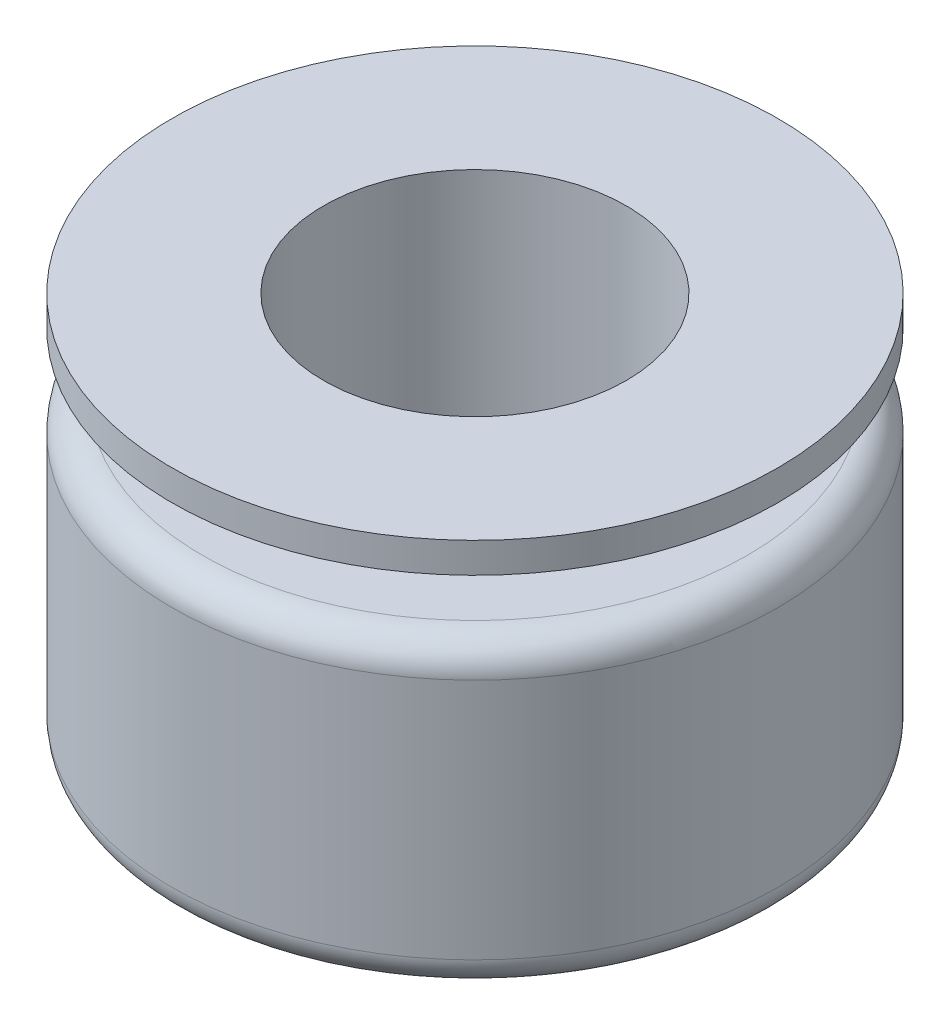
ISO-10303-21;
HEADER;
FILE_DESCRIPTION(('STEP AP214'),'2;1');
FILE_NAME('part.step','',(''),(''),'','','');
FILE_SCHEMA(('AUTOMOTIVE_DESIGN { 1 0 10303 214 1 1 1 1 }'));
ENDSEC;
DATA;
#1=APPLICATION_CONTEXT('core data for automotive mechanical design processes');
#2=APPLICATION_PROTOCOL_DEFINITION('international standard','automotive_design',2000,#1);
#3=PRODUCT_CONTEXT('',#1,'mechanical');
#4=PRODUCT('Part','Part','',(#3));
#5=PRODUCT_RELATED_PRODUCT_CATEGORY('part','',(#4));
#6=PRODUCT_DEFINITION_FORMATION('','',#4);
#7=PRODUCT_DEFINITION_CONTEXT('part definition',#1,'design');
#8=PRODUCT_DEFINITION('design','',#6,#7);
#9=PRODUCT_DEFINITION_SHAPE('','',#8);
#10=(LENGTH_UNIT() NAMED_UNIT(*) SI_UNIT(.MILLI.,.METRE.));
#11=(NAMED_UNIT(*) PLANE_ANGLE_UNIT() SI_UNIT($,.RADIAN.));
#12=(NAMED_UNIT(*) SI_UNIT($,.STERADIAN.) SOLID_ANGLE_UNIT());
#13=UNCERTAINTY_MEASURE_WITH_UNIT(LENGTH_MEASURE(1.E-05),#10,'distance_accuracy_value','');
#14=(GEOMETRIC_REPRESENTATION_CONTEXT(3) GLOBAL_UNCERTAINTY_ASSIGNED_CONTEXT((#13)) GLOBAL_UNIT_ASSIGNED_CONTEXT((#10,
#11,#12)) REPRESENTATION_CONTEXT('',''));
#15=CARTESIAN_POINT('',(0.,0.,0.));
#16=DIRECTION('',(0.,0.,1.));
#17=DIRECTION('',(1.,0.,0.));
#18=AXIS2_PLACEMENT_3D('',#15,#16,#17);
#19=CARTESIAN_POINT('',(15.,29.5,7.));
#20=DIRECTION('',(0.,1.,0.));
#21=DIRECTION('',(1.,0.,0.));
#22=AXIS2_PLACEMENT_3D('',#19,#20,#21);
#23=PLANE('',#22);
#24=CARTESIAN_POINT('',(15.,29.5,7.));
#25=DIRECTION('',(0.,1.,0.));
#26=DIRECTION('',(-1.,0.,0.));
#27=AXIS2_PLACEMENT_3D('',#24,#25,#26);
#28=CIRCLE('',#27,3.);
#29=CARTESIAN_POINT('',(18.,29.5,7.));
#30=VERTEX_POINT('',#29);
#31=EDGE_CURVE('E87',#30,#30,#28,.T.);
#32=ORIENTED_EDGE('',*,*,#31,.T.);
#33=EDGE_LOOP('',(#32));
#34=FACE_BOUND('',#33,.T.);
#35=CARTESIAN_POINT('',(15.,29.5,7.));
#36=DIRECTION('',(0.,1.,0.));
#37=DIRECTION('',(-1.,0.,0.));
#38=AXIS2_PLACEMENT_3D('',#35,#36,#37);
#39=CIRCLE('',#38,5.);
#40=CARTESIAN_POINT('',(20.,29.5,7.));
#41=VERTEX_POINT('',#40);
#42=EDGE_CURVE('E11',#41,#41,#39,.T.);
#43=ORIENTED_EDGE('',*,*,#42,.F.);
#44=EDGE_LOOP('',(#43));
#45=FACE_BOUND('',#44,.T.);
#46=ADVANCED_FACE('F17',(#34,#45),#23,.F.);
#47=CARTESIAN_POINT('',(15.,30.,7.));
#48=DIRECTION('',(0.,1.,0.));
#49=DIRECTION('',(1.,0.,0.));
#50=AXIS2_PLACEMENT_3D('',#47,#48,#49);
#51=PLANE('',#50);
#52=CARTESIAN_POINT('',(15.,30.,7.));
#53=DIRECTION('',(0.,-1.,0.));
#54=DIRECTION('',(-1.,0.,0.));
#55=AXIS2_PLACEMENT_3D('',#52,#53,#54);
#56=CIRCLE('',#55,2.5);
#57=CARTESIAN_POINT('',(17.5,30.,7.));
#58=VERTEX_POINT('',#57);
#59=EDGE_CURVE('E94',#58,#58,#56,.T.);
#60=ORIENTED_EDGE('',*,*,#59,.T.);
#61=EDGE_LOOP('',(#60));
#62=FACE_BOUND('',#61,.T.);
#63=CARTESIAN_POINT('',(15.,30.,7.));
#64=DIRECTION('',(0.,1.,0.));
#65=DIRECTION('',(-1.,0.,0.));
#66=AXIS2_PLACEMENT_3D('',#63,#64,#65);
#67=CIRCLE('',#66,5.);
#68=CARTESIAN_POINT('',(20.,30.,7.));
#69=VERTEX_POINT('',#68);
#70=EDGE_CURVE('E27',#69,#69,#67,.T.);
#71=ORIENTED_EDGE('',*,*,#70,.T.);
#72=EDGE_LOOP('',(#71));
#73=FACE_BOUND('',#72,.T.);
#74=ADVANCED_FACE('F112',(#62,#73),#51,.T.);
#75=CARTESIAN_POINT('',(15.,29.5,7.));
#76=DIRECTION('',(0.,1.,0.));
#77=DIRECTION('',(-1.,0.,0.));
#78=AXIS2_PLACEMENT_3D('',#75,#76,#77);
#79=CYLINDRICAL_SURFACE('',#78,5.);
#80=ORIENTED_EDGE('',*,*,#42,.T.);
#81=EDGE_LOOP('',(#80));
#82=FACE_BOUND('',#81,.T.);
#83=ORIENTED_EDGE('',*,*,#70,.F.);
#84=EDGE_LOOP('',(#83));
#85=FACE_BOUND('',#84,.T.);
#86=ADVANCED_FACE('F114',(#82,#85),#79,.T.);
#87=CARTESIAN_POINT('',(15.,29.5,7.));
#88=DIRECTION('',(0.,1.,0.));
#89=DIRECTION('',(-1.,0.,0.));
#90=AXIS2_PLACEMENT_3D('',#87,#88,#89);
#91=CYLINDRICAL_SURFACE('',#90,2.5);
#92=ORIENTED_EDGE('',*,*,#59,.F.);
#93=EDGE_LOOP('',(#92));
#94=FACE_BOUND('',#93,.T.);
#95=CARTESIAN_POINT('',(15.,23.5,7.));
#96=DIRECTION('',(0.,1.,0.));
#97=DIRECTION('',(-1.,0.,0.));
#98=AXIS2_PLACEMENT_3D('',#95,#96,#97);
#99=CIRCLE('',#98,2.5);
#100=CARTESIAN_POINT('',(17.5,23.5,7.));
#101=VERTEX_POINT('',#100);
#102=EDGE_CURVE('E20',#101,#101,#99,.T.);
#103=ORIENTED_EDGE('',*,*,#102,.F.);
#104=EDGE_LOOP('',(#103));
#105=FACE_BOUND('',#104,.T.);
#106=ADVANCED_FACE('F116',(#94,#105),#91,.F.);
#107=CARTESIAN_POINT('',(15.,29.5,7.));
#108=DIRECTION('',(0.,-1.,0.));
#109=DIRECTION('',(-1.,0.,0.));
#110=AXIS2_PLACEMENT_3D('',#107,#108,#109);
#111=CYLINDRICAL_SURFACE('',#110,3.);
#112=ORIENTED_EDGE('',*,*,#31,.F.);
#113=EDGE_LOOP('',(#112));
#114=FACE_BOUND('',#113,.T.);
#115=CARTESIAN_POINT('',(15.,28.5,7.));
#116=DIRECTION('',(0.,-1.,0.));
#117=DIRECTION('',(-1.,0.,0.));
#118=AXIS2_PLACEMENT_3D('',#115,#116,#117);
#119=CIRCLE('',#118,3.);
#120=CARTESIAN_POINT('',(18.,28.5,7.));
#121=VERTEX_POINT('',#120);
#122=EDGE_CURVE('E70',#121,#121,#119,.T.);
#123=ORIENTED_EDGE('',*,*,#122,.F.);
#124=EDGE_LOOP('',(#123));
#125=FACE_BOUND('',#124,.T.);
#126=ADVANCED_FACE('F123',(#114,#125),#111,.T.);
#127=CARTESIAN_POINT('',(15.,28.5,7.));
#128=DIRECTION('',(0.,1.,0.));
#129=DIRECTION('',(1.,0.,0.));
#130=AXIS2_PLACEMENT_3D('',#127,#128,#129);
#131=PLANE('',#130);
#132=ORIENTED_EDGE('',*,*,#122,.T.);
#133=EDGE_LOOP('',(#132));
#134=FACE_BOUND('',#133,.T.);
#135=CARTESIAN_POINT('',(15.,28.5,7.));
#136=DIRECTION('',(0.,-1.,0.));
#137=DIRECTION('',(-1.,0.,0.));
#138=AXIS2_PLACEMENT_3D('',#135,#136,#137);
#139=CIRCLE('',#138,4.5);
#140=CARTESIAN_POINT('',(19.5,28.5,7.));
#141=VERTEX_POINT('',#140);
#142=EDGE_CURVE('E77',#141,#141,#139,.T.);
#143=ORIENTED_EDGE('',*,*,#142,.F.);
#144=EDGE_LOOP('',(#143));
#145=FACE_BOUND('',#144,.T.);
#146=ADVANCED_FACE('F140',(#134,#145),#131,.T.);
#147=CARTESIAN_POINT('',(15.,28.,7.));
#148=DIRECTION('',(0.,1.,0.));
#149=DIRECTION('',(0.,0.,1.));
#150=AXIS2_PLACEMENT_3D('',#147,#148,#149);
#151=TOROIDAL_SURFACE('',#150,4.5,0.5);
#152=ORIENTED_EDGE('',*,*,#142,.T.);
#153=EDGE_LOOP('',(#152));
#154=FACE_BOUND('',#153,.T.);
#155=CARTESIAN_POINT('',(15.,28.,7.));
#156=DIRECTION('',(0.,1.,0.));
#157=DIRECTION('',(-1.,0.,0.));
#158=AXIS2_PLACEMENT_3D('',#155,#156,#157);
#159=CIRCLE('',#158,5.);
#160=CARTESIAN_POINT('',(20.,28.,7.));
#161=VERTEX_POINT('',#160);
#162=EDGE_CURVE('E90',#161,#161,#159,.T.);
#163=ORIENTED_EDGE('',*,*,#162,.T.);
#164=EDGE_LOOP('',(#163));
#165=FACE_BOUND('',#164,.T.);
#166=ADVANCED_FACE('F78',(#154,#165),#151,.T.);
#167=CARTESIAN_POINT('',(15.,23.5,7.));
#168=DIRECTION('',(0.,1.,0.));
#169=DIRECTION('',(1.,0.,0.));
#170=AXIS2_PLACEMENT_3D('',#167,#168,#169);
#171=PLANE('',#170);
#172=ORIENTED_EDGE('',*,*,#102,.T.);
#173=EDGE_LOOP('',(#172));
#174=FACE_BOUND('',#173,.T.);
#175=CARTESIAN_POINT('',(15.,23.5,7.));
#176=DIRECTION('',(0.,1.,0.));
#177=DIRECTION('',(-1.,0.,0.));
#178=AXIS2_PLACEMENT_3D('',#175,#176,#177);
#179=CIRCLE('',#178,4.5);
#180=CARTESIAN_POINT('',(19.5,23.5,7.));
#181=VERTEX_POINT('',#180);
#182=EDGE_CURVE('E97',#181,#181,#179,.T.);
#183=ORIENTED_EDGE('',*,*,#182,.F.);
#184=EDGE_LOOP('',(#183));
#185=FACE_BOUND('',#184,.T.);
#186=ADVANCED_FACE('F151',(#174,#185),#171,.F.);
#187=CARTESIAN_POINT('',(15.,28.5,7.));
#188=DIRECTION('',(0.,-1.,0.));
#189=DIRECTION('',(-1.,0.,0.));
#190=AXIS2_PLACEMENT_3D('',#187,#188,#189);
#191=CYLINDRICAL_SURFACE('',#190,5.);
#192=CARTESIAN_POINT('',(15.,24.,7.));
#193=DIRECTION('',(0.,-1.,0.));
#194=DIRECTION('',(-1.,0.,0.));
#195=AXIS2_PLACEMENT_3D('',#192,#193,#194);
#196=CIRCLE('',#195,5.);
#197=CARTESIAN_POINT('',(20.,24.,7.));
#198=VERTEX_POINT('',#197);
#199=EDGE_CURVE('E98',#198,#198,#196,.T.);
#200=ORIENTED_EDGE('',*,*,#199,.F.);
#201=EDGE_LOOP('',(#200));
#202=FACE_BOUND('',#201,.T.);
#203=ORIENTED_EDGE('',*,*,#162,.F.);
#204=EDGE_LOOP('',(#203));
#205=FACE_BOUND('',#204,.T.);
#206=ADVANCED_FACE('F150',(#202,#205),#191,.T.);
#207=CARTESIAN_POINT('',(15.,24.,7.));
#208=DIRECTION('',(0.,-1.,0.));
#209=DIRECTION('',(0.,0.,-1.));
#210=AXIS2_PLACEMENT_3D('',#207,#208,#209);
#211=TOROIDAL_SURFACE('',#210,4.5,0.5);
#212=ORIENTED_EDGE('',*,*,#182,.T.);
#213=EDGE_LOOP('',(#212));
#214=FACE_BOUND('',#213,.T.);
#215=ORIENTED_EDGE('',*,*,#199,.T.);
#216=EDGE_LOOP('',(#215));
#217=FACE_BOUND('',#216,.T.);
#218=ADVANCED_FACE('F147',(#214,#217),#211,.T.);
#219=CLOSED_SHELL('',(#46,#74,#86,#106,#126,#146,#166,#186,#206,#218));
#220=MANIFOLD_SOLID_BREP('B1',#219);
#221=ADVANCED_BREP_SHAPE_REPRESENTATION('',(#18,#220),#14);
#222=SHAPE_DEFINITION_REPRESENTATION(#9,#221);
ENDSEC;
END-ISO-10303-21;
